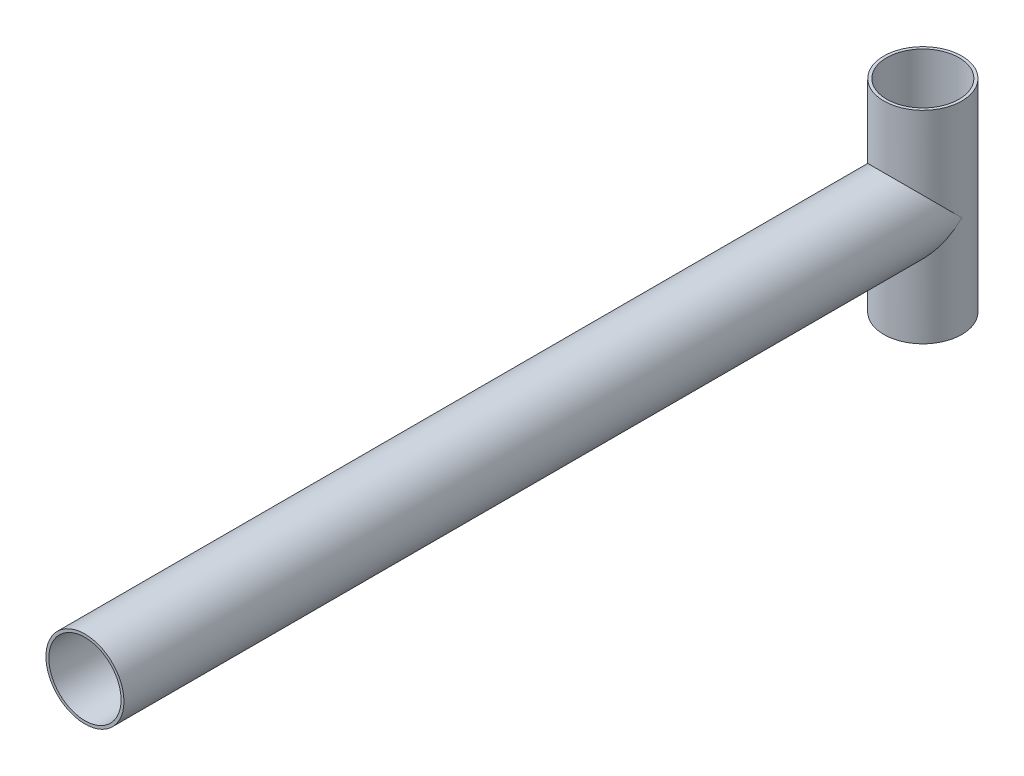
ISO-10303-21;
HEADER;
FILE_DESCRIPTION(('STEP AP214'),'2;1');
FILE_NAME('part.step','',(''),(''),'','','');
FILE_SCHEMA(('AUTOMOTIVE_DESIGN { 1 0 10303 214 1 1 1 1 }'));
ENDSEC;
DATA;
#1=APPLICATION_CONTEXT('core data for automotive mechanical design processes');
#2=APPLICATION_PROTOCOL_DEFINITION('international standard','automotive_design',2000,#1);
#3=PRODUCT_CONTEXT('',#1,'mechanical');
#4=PRODUCT('Part','Part','',(#3));
#5=PRODUCT_RELATED_PRODUCT_CATEGORY('part','',(#4));
#6=PRODUCT_DEFINITION_FORMATION('','',#4);
#7=PRODUCT_DEFINITION_CONTEXT('part definition',#1,'design');
#8=PRODUCT_DEFINITION('design','',#6,#7);
#9=PRODUCT_DEFINITION_SHAPE('','',#8);
#10=(LENGTH_UNIT() NAMED_UNIT(*) SI_UNIT(.MILLI.,.METRE.));
#11=(NAMED_UNIT(*) PLANE_ANGLE_UNIT() SI_UNIT($,.RADIAN.));
#12=(NAMED_UNIT(*) SI_UNIT($,.STERADIAN.) SOLID_ANGLE_UNIT());
#13=UNCERTAINTY_MEASURE_WITH_UNIT(LENGTH_MEASURE(1.E-05),#10,'distance_accuracy_value','');
#14=(GEOMETRIC_REPRESENTATION_CONTEXT(3) GLOBAL_UNCERTAINTY_ASSIGNED_CONTEXT((#13)) GLOBAL_UNIT_ASSIGNED_CONTEXT((#10,
#11,#12)) REPRESENTATION_CONTEXT('',''));
#15=CARTESIAN_POINT('',(0.,0.,0.));
#16=DIRECTION('',(0.,0.,1.));
#17=DIRECTION('',(1.,0.,0.));
#18=AXIS2_PLACEMENT_3D('',#15,#16,#17);
#19=CARTESIAN_POINT('',(0.,35.,0.));
#20=DIRECTION('',(0.,-1.,0.));
#21=DIRECTION('',(0.,0.,-1.));
#22=AXIS2_PLACEMENT_3D('',#19,#20,#21);
#23=CYLINDRICAL_SURFACE('',#22,13.5);
#24=CARTESIAN_POINT('',(0.,-35.,0.));
#25=DIRECTION('',(0.,1.,0.));
#26=DIRECTION('',(0.,0.,1.));
#27=AXIS2_PLACEMENT_3D('',#24,#25,#26);
#28=CIRCLE('',#27,13.5);
#29=CARTESIAN_POINT('',(0.,-35.,13.5));
#30=VERTEX_POINT('',#29);
#31=EDGE_CURVE('E74',#30,#30,#28,.T.);
#32=ORIENTED_EDGE('',*,*,#31,.T.);
#33=EDGE_LOOP('',(#32));
#34=FACE_BOUND('',#33,.T.);
#35=CARTESIAN_POINT('',(0.,35.,0.));
#36=DIRECTION('',(0.,1.,0.));
#37=DIRECTION('',(0.,0.,1.));
#38=AXIS2_PLACEMENT_3D('',#35,#36,#37);
#39=CIRCLE('',#38,13.5);
#40=CARTESIAN_POINT('',(0.,35.,13.5));
#41=VERTEX_POINT('',#40);
#42=EDGE_CURVE('E75',#41,#41,#39,.T.);
#43=ORIENTED_EDGE('',*,*,#42,.F.);
#44=EDGE_LOOP('',(#43));
#45=FACE_BOUND('',#44,.T.);
#46=CARTESIAN_POINT('',(0.,0.,0.));
#47=DIRECTION('',(0.,-0.707106781186547,-0.707106781186547));
#48=DIRECTION('',(0.,-0.707106781186547,0.707106781186547));
#49=AXIS2_PLACEMENT_3D('',#46,#47,#48);
#50=ELLIPSE('',#49,19.0918830920368,13.5);
#51=CARTESIAN_POINT('',(-13.5,0.,0.));
#52=VERTEX_POINT('',#51);
#53=CARTESIAN_POINT('',(13.5,0.,0.));
#54=VERTEX_POINT('',#53);
#55=EDGE_CURVE('E11',#52,#54,#50,.F.);
#56=ORIENTED_EDGE('',*,*,#55,.F.);
#57=CARTESIAN_POINT('',(0.,0.,0.));
#58=DIRECTION('',(0.,-0.707106781186547,0.707106781186547));
#59=DIRECTION('',(0.,-0.707106781186547,-0.707106781186547));
#60=AXIS2_PLACEMENT_3D('',#57,#58,#59);
#61=ELLIPSE('',#60,19.0918830920368,13.5);
#62=EDGE_CURVE('E39',#54,#52,#61,.T.);
#63=ORIENTED_EDGE('',*,*,#62,.F.);
#64=EDGE_LOOP('',(#56,#63));
#65=FACE_BOUND('',#64,.T.);
#66=ADVANCED_FACE('F32',(#34,#45,#65),#23,.T.);
#67=CARTESIAN_POINT('',(0.,35.,0.));
#68=DIRECTION('',(0.,1.,0.));
#69=DIRECTION('',(0.,0.,1.));
#70=AXIS2_PLACEMENT_3D('',#67,#68,#69);
#71=PLANE('',#70);
#72=CARTESIAN_POINT('',(0.,35.,0.));
#73=DIRECTION('',(0.,1.,0.));
#74=DIRECTION('',(0.,0.,1.));
#75=AXIS2_PLACEMENT_3D('',#72,#73,#74);
#76=CIRCLE('',#75,12.5);
#77=CARTESIAN_POINT('',(0.,35.,12.5));
#78=VERTEX_POINT('',#77);
#79=EDGE_CURVE('E61',#78,#78,#76,.T.);
#80=ORIENTED_EDGE('',*,*,#79,.F.);
#81=EDGE_LOOP('',(#80));
#82=FACE_BOUND('',#81,.T.);
#83=ORIENTED_EDGE('',*,*,#42,.T.);
#84=EDGE_LOOP('',(#83));
#85=FACE_BOUND('',#84,.T.);
#86=ADVANCED_FACE('F92',(#82,#85),#71,.T.);
#87=CARTESIAN_POINT('',(0.,-35.,0.));
#88=DIRECTION('',(0.,1.,0.));
#89=DIRECTION('',(0.,0.,1.));
#90=AXIS2_PLACEMENT_3D('',#87,#88,#89);
#91=PLANE('',#90);
#92=CARTESIAN_POINT('',(0.,-35.,0.));
#93=DIRECTION('',(0.,1.,0.));
#94=DIRECTION('',(0.,0.,1.));
#95=AXIS2_PLACEMENT_3D('',#92,#93,#94);
#96=CIRCLE('',#95,12.5);
#97=CARTESIAN_POINT('',(0.,-35.,12.5));
#98=VERTEX_POINT('',#97);
#99=EDGE_CURVE('E64',#98,#98,#96,.T.);
#100=ORIENTED_EDGE('',*,*,#99,.T.);
#101=EDGE_LOOP('',(#100));
#102=FACE_BOUND('',#101,.T.);
#103=ORIENTED_EDGE('',*,*,#31,.F.);
#104=EDGE_LOOP('',(#103));
#105=FACE_BOUND('',#104,.T.);
#106=ADVANCED_FACE('F83',(#102,#105),#91,.F.);
#107=CARTESIAN_POINT('',(0.,0.,290.));
#108=DIRECTION('',(0.,0.,-1.));
#109=DIRECTION('',(-1.,0.,0.));
#110=AXIS2_PLACEMENT_3D('',#107,#108,#109);
#111=CYLINDRICAL_SURFACE('',#110,13.5);
#112=CARTESIAN_POINT('',(0.,0.,290.));
#113=DIRECTION('',(0.,0.,1.));
#114=DIRECTION('',(1.,0.,0.));
#115=AXIS2_PLACEMENT_3D('',#112,#113,#114);
#116=CIRCLE('',#115,13.5);
#117=CARTESIAN_POINT('',(13.5,0.,290.));
#118=VERTEX_POINT('',#117);
#119=EDGE_CURVE('E58',#118,#118,#116,.T.);
#120=ORIENTED_EDGE('',*,*,#119,.F.);
#121=EDGE_LOOP('',(#120));
#122=FACE_BOUND('',#121,.T.);
#123=ORIENTED_EDGE('',*,*,#62,.T.);
#124=ORIENTED_EDGE('',*,*,#55,.T.);
#125=EDGE_LOOP('',(#123,#124));
#126=FACE_BOUND('',#125,.T.);
#127=ADVANCED_FACE('F80',(#122,#126),#111,.T.);
#128=CARTESIAN_POINT('',(0.,0.,290.));
#129=DIRECTION('',(0.,0.,1.));
#130=DIRECTION('',(1.,0.,0.));
#131=AXIS2_PLACEMENT_3D('',#128,#129,#130);
#132=PLANE('',#131);
#133=CARTESIAN_POINT('',(0.,0.,290.));
#134=DIRECTION('',(0.,0.,1.));
#135=DIRECTION('',(1.,0.,0.));
#136=AXIS2_PLACEMENT_3D('',#133,#134,#135);
#137=CIRCLE('',#136,12.5);
#138=CARTESIAN_POINT('',(12.5,0.,290.));
#139=VERTEX_POINT('',#138);
#140=EDGE_CURVE('E68',#139,#139,#137,.T.);
#141=ORIENTED_EDGE('',*,*,#140,.F.);
#142=EDGE_LOOP('',(#141));
#143=FACE_BOUND('',#142,.T.);
#144=ORIENTED_EDGE('',*,*,#119,.T.);
#145=EDGE_LOOP('',(#144));
#146=FACE_BOUND('',#145,.T.);
#147=ADVANCED_FACE('F82',(#143,#146),#132,.T.);
#148=CARTESIAN_POINT('',(0.,35.,0.));
#149=DIRECTION('',(0.,-1.,0.));
#150=DIRECTION('',(0.,0.,-1.));
#151=AXIS2_PLACEMENT_3D('',#148,#149,#150);
#152=CYLINDRICAL_SURFACE('',#151,12.5);
#153=ORIENTED_EDGE('',*,*,#99,.F.);
#154=EDGE_LOOP('',(#153));
#155=FACE_BOUND('',#154,.T.);
#156=ORIENTED_EDGE('',*,*,#79,.T.);
#157=EDGE_LOOP('',(#156));
#158=FACE_BOUND('',#157,.T.);
#159=CARTESIAN_POINT('',(0.,0.,0.));
#160=DIRECTION('',(0.,-0.707106781186547,-0.707106781186547));
#161=DIRECTION('',(0.,-0.707106781186547,0.707106781186547));
#162=AXIS2_PLACEMENT_3D('',#159,#160,#161);
#163=ELLIPSE('',#162,17.6776695296637,12.5);
#164=CARTESIAN_POINT('',(-12.5,0.,0.));
#165=VERTEX_POINT('',#164);
#166=CARTESIAN_POINT('',(12.5,0.,0.));
#167=VERTEX_POINT('',#166);
#168=EDGE_CURVE('E53',#165,#167,#163,.F.);
#169=ORIENTED_EDGE('',*,*,#168,.T.);
#170=CARTESIAN_POINT('',(0.,0.,0.));
#171=DIRECTION('',(0.,-0.707106781186547,0.707106781186547));
#172=DIRECTION('',(0.,-0.707106781186547,-0.707106781186547));
#173=AXIS2_PLACEMENT_3D('',#170,#171,#172);
#174=ELLIPSE('',#173,17.6776695296637,12.5);
#175=EDGE_CURVE('E56',#167,#165,#174,.T.);
#176=ORIENTED_EDGE('',*,*,#175,.T.);
#177=EDGE_LOOP('',(#169,#176));
#178=FACE_BOUND('',#177,.T.);
#179=ADVANCED_FACE('F60',(#155,#158,#178),#152,.F.);
#180=CARTESIAN_POINT('',(0.,0.,290.));
#181=DIRECTION('',(0.,0.,-1.));
#182=DIRECTION('',(-1.,0.,0.));
#183=AXIS2_PLACEMENT_3D('',#180,#181,#182);
#184=CYLINDRICAL_SURFACE('',#183,12.5);
#185=ORIENTED_EDGE('',*,*,#140,.T.);
#186=EDGE_LOOP('',(#185));
#187=FACE_BOUND('',#186,.T.);
#188=ORIENTED_EDGE('',*,*,#175,.F.);
#189=ORIENTED_EDGE('',*,*,#168,.F.);
#190=EDGE_LOOP('',(#188,#189));
#191=FACE_BOUND('',#190,.T.);
#192=ADVANCED_FACE('F55',(#187,#191),#184,.F.);
#193=CLOSED_SHELL('',(#66,#86,#106,#127,#147,#179,#192));
#194=MANIFOLD_SOLID_BREP('B2',#193);
#195=ADVANCED_BREP_SHAPE_REPRESENTATION('',(#18,#194),#14);
#196=SHAPE_DEFINITION_REPRESENTATION(#9,#195);
ENDSEC;
END-ISO-10303-21;
